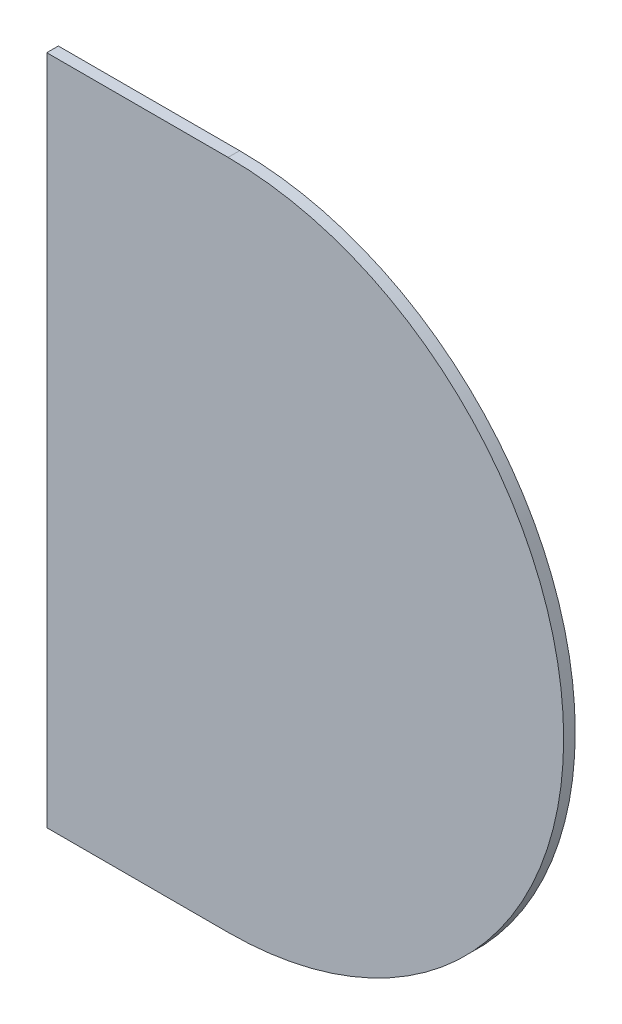
ISO-10303-21;
HEADER;
FILE_DESCRIPTION(('STEP AP214'),'2;1');
FILE_NAME('part.step','',(''),(''),'','','');
FILE_SCHEMA(('AUTOMOTIVE_DESIGN { 1 0 10303 214 1 1 1 1 }'));
ENDSEC;
DATA;
#1=APPLICATION_CONTEXT('core data for automotive mechanical design processes');
#2=APPLICATION_PROTOCOL_DEFINITION('international standard','automotive_design',2000,#1);
#3=PRODUCT_CONTEXT('',#1,'mechanical');
#4=PRODUCT('Part','Part','',(#3));
#5=PRODUCT_RELATED_PRODUCT_CATEGORY('part','',(#4));
#6=PRODUCT_DEFINITION_FORMATION('','',#4);
#7=PRODUCT_DEFINITION_CONTEXT('part definition',#1,'design');
#8=PRODUCT_DEFINITION('design','',#6,#7);
#9=PRODUCT_DEFINITION_SHAPE('','',#8);
#10=(LENGTH_UNIT() NAMED_UNIT(*) SI_UNIT(.MILLI.,.METRE.));
#11=(NAMED_UNIT(*) PLANE_ANGLE_UNIT() SI_UNIT($,.RADIAN.));
#12=(NAMED_UNIT(*) SI_UNIT($,.STERADIAN.) SOLID_ANGLE_UNIT());
#13=UNCERTAINTY_MEASURE_WITH_UNIT(LENGTH_MEASURE(1.E-05),#10,'distance_accuracy_value','');
#14=(GEOMETRIC_REPRESENTATION_CONTEXT(3) GLOBAL_UNCERTAINTY_ASSIGNED_CONTEXT((#13)) GLOBAL_UNIT_ASSIGNED_CONTEXT((#10,
#11,#12)) REPRESENTATION_CONTEXT('',''));
#15=CARTESIAN_POINT('',(0.,0.,0.));
#16=DIRECTION('',(0.,0.,1.));
#17=DIRECTION('',(1.,0.,0.));
#18=AXIS2_PLACEMENT_3D('',#15,#16,#17);
#19=CARTESIAN_POINT('',(0.,0.,30.));
#20=DIRECTION('',(1.,0.,0.));
#21=DIRECTION('',(0.,1.,0.));
#22=AXIS2_PLACEMENT_3D('',#19,#20,#21);
#23=PLANE('',#22);
#24=DIRECTION('',(0.,-1.,0.));
#25=VECTOR('',#24,1.);
#26=CARTESIAN_POINT('',(0.,0.,0.));
#27=LINE('',#26,#25);
#28=CARTESIAN_POINT('',(-3.33066907387547E-13,1740.,0.));
#29=VERTEX_POINT('',#28);
#30=CARTESIAN_POINT('',(0.,0.,0.));
#31=VERTEX_POINT('',#30);
#32=EDGE_CURVE('E109',#29,#31,#27,.T.);
#33=ORIENTED_EDGE('',*,*,#32,.T.);
#34=DIRECTION('',(0.,0.,-1.));
#35=VECTOR('',#34,1.);
#36=CARTESIAN_POINT('',(0.,0.,30.));
#37=LINE('',#36,#35);
#38=CARTESIAN_POINT('',(0.,0.,30.));
#39=VERTEX_POINT('',#38);
#40=EDGE_CURVE('E11',#39,#31,#37,.T.);
#41=ORIENTED_EDGE('',*,*,#40,.F.);
#42=DIRECTION('',(0.,-1.,0.));
#43=VECTOR('',#42,1.);
#44=CARTESIAN_POINT('',(0.,0.,30.));
#45=LINE('',#44,#43);
#46=CARTESIAN_POINT('',(-3.33066907387547E-13,1740.,30.));
#47=VERTEX_POINT('',#46);
#48=EDGE_CURVE('E93',#47,#39,#45,.T.);
#49=ORIENTED_EDGE('',*,*,#48,.F.);
#50=DIRECTION('',(0.,0.,-1.));
#51=VECTOR('',#50,1.);
#52=CARTESIAN_POINT('',(-3.33066907387547E-13,1740.,30.));
#53=LINE('',#52,#51);
#54=EDGE_CURVE('E105',#47,#29,#53,.T.);
#55=ORIENTED_EDGE('',*,*,#54,.T.);
#56=EDGE_LOOP('',(#33,#41,#49,#55));
#57=FACE_BOUND('',#56,.T.);
#58=ADVANCED_FACE('F41',(#57),#23,.F.);
#59=CARTESIAN_POINT('',(0.,0.,30.));
#60=DIRECTION('',(0.,1.,0.));
#61=DIRECTION('',(0.,0.,1.));
#62=AXIS2_PLACEMENT_3D('',#59,#60,#61);
#63=PLANE('',#62);
#64=DIRECTION('',(1.,0.,0.));
#65=VECTOR('',#64,1.);
#66=CARTESIAN_POINT('',(0.,0.,0.));
#67=LINE('',#66,#65);
#68=CARTESIAN_POINT('',(470.,0.,0.));
#69=VERTEX_POINT('',#68);
#70=EDGE_CURVE('E98',#31,#69,#67,.T.);
#71=ORIENTED_EDGE('',*,*,#70,.T.);
#72=DIRECTION('',(0.,0.,-1.));
#73=VECTOR('',#72,1.);
#74=CARTESIAN_POINT('',(470.,0.,30.));
#75=LINE('',#74,#73);
#76=CARTESIAN_POINT('',(470.,0.,30.));
#77=VERTEX_POINT('',#76);
#78=EDGE_CURVE('E50',#77,#69,#75,.T.);
#79=ORIENTED_EDGE('',*,*,#78,.F.);
#80=DIRECTION('',(1.,0.,0.));
#81=VECTOR('',#80,1.);
#82=CARTESIAN_POINT('',(0.,0.,30.));
#83=LINE('',#82,#81);
#84=EDGE_CURVE('E88',#39,#77,#83,.T.);
#85=ORIENTED_EDGE('',*,*,#84,.F.);
#86=ORIENTED_EDGE('',*,*,#40,.T.);
#87=EDGE_LOOP('',(#71,#79,#85,#86));
#88=FACE_BOUND('',#87,.T.);
#89=ADVANCED_FACE('F97',(#88),#63,.F.);
#90=CARTESIAN_POINT('',(470.,870.,30.));
#91=DIRECTION('',(0.,0.,-1.));
#92=DIRECTION('',(-1.,0.,0.));
#93=AXIS2_PLACEMENT_3D('',#90,#91,#92);
#94=CYLINDRICAL_SURFACE('',#93,870.);
#95=CARTESIAN_POINT('',(470.,870.,0.));
#96=DIRECTION('',(0.,0.,1.));
#97=DIRECTION('',(-1.,0.,0.));
#98=AXIS2_PLACEMENT_3D('',#95,#96,#97);
#99=CIRCLE('',#98,870.);
#100=CARTESIAN_POINT('',(470.,1740.,0.));
#101=VERTEX_POINT('',#100);
#102=EDGE_CURVE('E75',#69,#101,#99,.T.);
#103=ORIENTED_EDGE('',*,*,#102,.T.);
#104=DIRECTION('',(0.,0.,-1.));
#105=VECTOR('',#104,1.);
#106=CARTESIAN_POINT('',(470.,1740.,30.));
#107=LINE('',#106,#105);
#108=CARTESIAN_POINT('',(470.,1740.,30.));
#109=VERTEX_POINT('',#108);
#110=EDGE_CURVE('E100',#109,#101,#107,.T.);
#111=ORIENTED_EDGE('',*,*,#110,.F.);
#112=CARTESIAN_POINT('',(470.,870.,30.));
#113=DIRECTION('',(0.,0.,1.));
#114=DIRECTION('',(-1.,0.,0.));
#115=AXIS2_PLACEMENT_3D('',#112,#113,#114);
#116=CIRCLE('',#115,870.);
#117=EDGE_CURVE('E91',#77,#109,#116,.T.);
#118=ORIENTED_EDGE('',*,*,#117,.F.);
#119=ORIENTED_EDGE('',*,*,#78,.T.);
#120=EDGE_LOOP('',(#103,#111,#118,#119));
#121=FACE_BOUND('',#120,.T.);
#122=ADVANCED_FACE('F101',(#121),#94,.T.);
#123=CARTESIAN_POINT('',(-3.33066907387547E-13,1740.,30.));
#124=DIRECTION('',(0.,-1.,0.));
#125=DIRECTION('',(0.,0.,-1.));
#126=AXIS2_PLACEMENT_3D('',#123,#124,#125);
#127=PLANE('',#126);
#128=DIRECTION('',(-1.,0.,0.));
#129=VECTOR('',#128,1.);
#130=CARTESIAN_POINT('',(-3.33066907387547E-13,1740.,0.));
#131=LINE('',#130,#129);
#132=EDGE_CURVE('E81',#101,#29,#131,.T.);
#133=ORIENTED_EDGE('',*,*,#132,.T.);
#134=ORIENTED_EDGE('',*,*,#54,.F.);
#135=DIRECTION('',(-1.,0.,0.));
#136=VECTOR('',#135,1.);
#137=CARTESIAN_POINT('',(-3.33066907387547E-13,1740.,30.));
#138=LINE('',#137,#136);
#139=EDGE_CURVE('E58',#109,#47,#138,.T.);
#140=ORIENTED_EDGE('',*,*,#139,.F.);
#141=ORIENTED_EDGE('',*,*,#110,.T.);
#142=EDGE_LOOP('',(#133,#134,#140,#141));
#143=FACE_BOUND('',#142,.T.);
#144=ADVANCED_FACE('F122',(#143),#127,.F.);
#145=CARTESIAN_POINT('',(470.,870.,30.));
#146=DIRECTION('',(0.,0.,-1.));
#147=DIRECTION('',(-1.,0.,0.));
#148=AXIS2_PLACEMENT_3D('',#145,#146,#147);
#149=PLANE('',#148);
#150=ORIENTED_EDGE('',*,*,#48,.T.);
#151=ORIENTED_EDGE('',*,*,#84,.T.);
#152=ORIENTED_EDGE('',*,*,#117,.T.);
#153=ORIENTED_EDGE('',*,*,#139,.T.);
#154=EDGE_LOOP('',(#150,#151,#152,#153));
#155=FACE_BOUND('',#154,.T.);
#156=ADVANCED_FACE('F89',(#155),#149,.F.);
#157=CARTESIAN_POINT('',(470.,870.,0.));
#158=DIRECTION('',(0.,0.,-1.));
#159=DIRECTION('',(-1.,0.,0.));
#160=AXIS2_PLACEMENT_3D('',#157,#158,#159);
#161=PLANE('',#160);
#162=ORIENTED_EDGE('',*,*,#32,.F.);
#163=ORIENTED_EDGE('',*,*,#132,.F.);
#164=ORIENTED_EDGE('',*,*,#102,.F.);
#165=ORIENTED_EDGE('',*,*,#70,.F.);
#166=EDGE_LOOP('',(#162,#163,#164,#165));
#167=FACE_BOUND('',#166,.T.);
#168=ADVANCED_FACE('F125',(#167),#161,.T.);
#169=CLOSED_SHELL('',(#58,#89,#122,#144,#156,#168));
#170=MANIFOLD_SOLID_BREP('B2',#169);
#171=ADVANCED_BREP_SHAPE_REPRESENTATION('',(#18,#170),#14);
#172=SHAPE_DEFINITION_REPRESENTATION(#9,#171);
ENDSEC;
END-ISO-10303-21;
